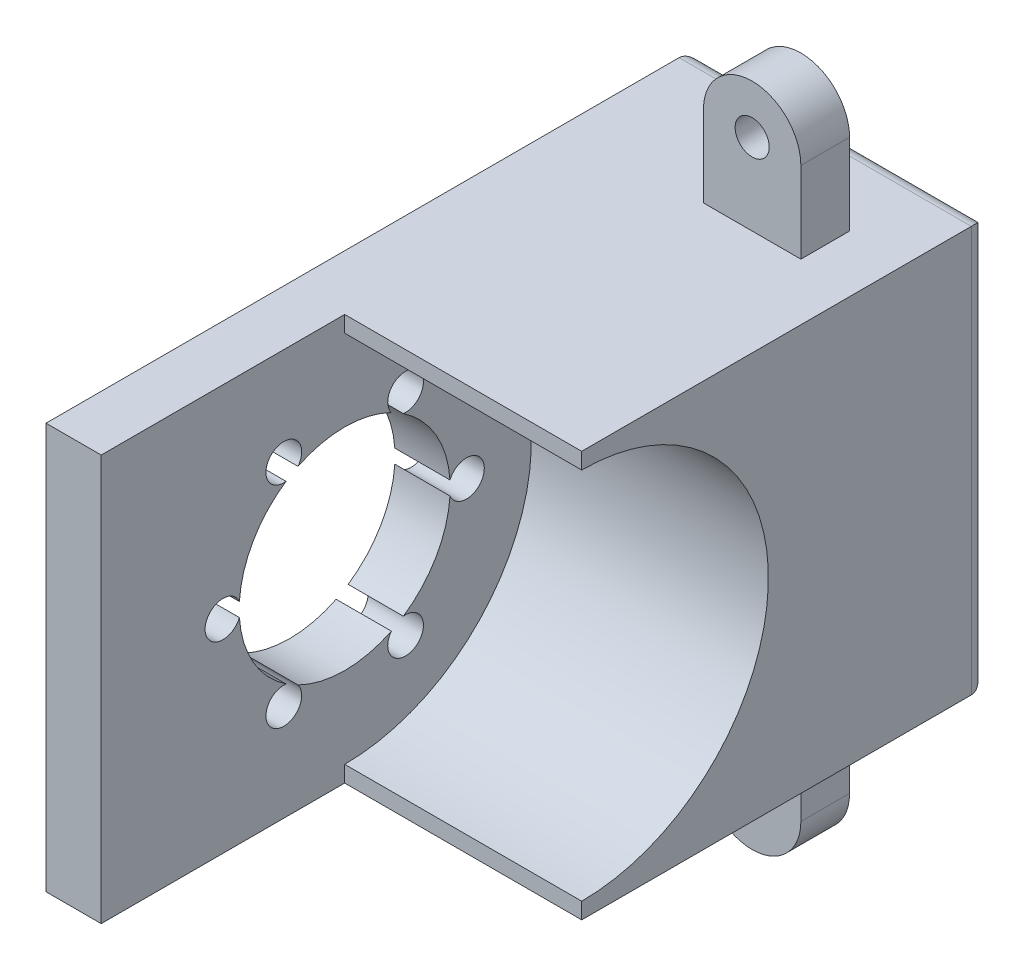
ISO-10303-21;
HEADER;
FILE_DESCRIPTION(('STEP AP214'),'2;1');
FILE_NAME('part.step','',(''),(''),'','','');
FILE_SCHEMA(('AUTOMOTIVE_DESIGN { 1 0 10303 214 1 1 1 1 }'));
ENDSEC;
DATA;
#1=APPLICATION_CONTEXT('core data for automotive mechanical design processes');
#2=APPLICATION_PROTOCOL_DEFINITION('international standard','automotive_design',2000,#1);
#3=PRODUCT_CONTEXT('',#1,'mechanical');
#4=PRODUCT('Part','Part','',(#3));
#5=PRODUCT_RELATED_PRODUCT_CATEGORY('part','',(#4));
#6=PRODUCT_DEFINITION_FORMATION('','',#4);
#7=PRODUCT_DEFINITION_CONTEXT('part definition',#1,'design');
#8=PRODUCT_DEFINITION('design','',#6,#7);
#9=PRODUCT_DEFINITION_SHAPE('','',#8);
#10=(LENGTH_UNIT() NAMED_UNIT(*) SI_UNIT(.MILLI.,.METRE.));
#11=(NAMED_UNIT(*) PLANE_ANGLE_UNIT() SI_UNIT($,.RADIAN.));
#12=(NAMED_UNIT(*) SI_UNIT($,.STERADIAN.) SOLID_ANGLE_UNIT());
#13=UNCERTAINTY_MEASURE_WITH_UNIT(LENGTH_MEASURE(1.E-05),#10,'distance_accuracy_value','');
#14=(GEOMETRIC_REPRESENTATION_CONTEXT(3) GLOBAL_UNCERTAINTY_ASSIGNED_CONTEXT((#13)) GLOBAL_UNIT_ASSIGNED_CONTEXT((#10,
#11,#12)) REPRESENTATION_CONTEXT('',''));
#15=CARTESIAN_POINT('',(0.,0.,0.));
#16=DIRECTION('',(0.,0.,1.));
#17=DIRECTION('',(1.,0.,0.));
#18=AXIS2_PLACEMENT_3D('',#15,#16,#17);
#19=CARTESIAN_POINT('',(-3.,-17.5,-17.));
#20=DIRECTION('',(-1.,0.,0.));
#21=DIRECTION('',(0.,-1.,0.));
#22=AXIS2_PLACEMENT_3D('',#19,#20,#21);
#23=PLANE('',#22);
#24=DIRECTION('',(0.,0.,-1.));
#25=VECTOR('',#24,1.);
#26=CARTESIAN_POINT('',(-3.,-12.5,-17.));
#27=LINE('',#26,#25);
#28=CARTESIAN_POINT('',(-3.,-12.5,-17.));
#29=VERTEX_POINT('',#28);
#30=CARTESIAN_POINT('',(-3.,-12.5,-20.));
#31=VERTEX_POINT('',#30);
#32=EDGE_CURVE('E542',#29,#31,#27,.T.);
#33=ORIENTED_EDGE('',*,*,#32,.T.);
#34=DIRECTION('',(0.,1.,0.));
#35=VECTOR('',#34,1.);
#36=CARTESIAN_POINT('',(-3.,-17.5,-20.));
#37=LINE('',#36,#35);
#38=CARTESIAN_POINT('',(-3.,-17.5,-20.));
#39=VERTEX_POINT('',#38);
#40=EDGE_CURVE('E520',#39,#31,#37,.T.);
#41=ORIENTED_EDGE('',*,*,#40,.F.);
#42=DIRECTION('',(0.,0.,-1.));
#43=VECTOR('',#42,1.);
#44=CARTESIAN_POINT('',(-3.,-17.5,-17.));
#45=LINE('',#44,#43);
#46=CARTESIAN_POINT('',(-3.,-17.5,-17.));
#47=VERTEX_POINT('',#46);
#48=EDGE_CURVE('E543',#47,#39,#45,.T.);
#49=ORIENTED_EDGE('',*,*,#48,.F.);
#50=DIRECTION('',(0.,1.,0.));
#51=VECTOR('',#50,1.);
#52=CARTESIAN_POINT('',(-3.,-17.5,-17.));
#53=LINE('',#52,#51);
#54=EDGE_CURVE('E530',#47,#29,#53,.T.);
#55=ORIENTED_EDGE('',*,*,#54,.T.);
#56=EDGE_LOOP('',(#33,#41,#49,#55));
#57=FACE_BOUND('',#56,.T.);
#58=ADVANCED_FACE('F95',(#57),#23,.T.);
#59=CARTESIAN_POINT('',(0.,-17.5,-17.));
#60=DIRECTION('',(0.,0.,-1.));
#61=DIRECTION('',(-1.,0.,0.));
#62=AXIS2_PLACEMENT_3D('',#59,#60,#61);
#63=CYLINDRICAL_SURFACE('',#62,3.);
#64=ORIENTED_EDGE('',*,*,#48,.T.);
#65=CARTESIAN_POINT('',(0.,-17.5,-20.));
#66=DIRECTION('',(0.,0.,-1.));
#67=DIRECTION('',(-1.,0.,0.));
#68=AXIS2_PLACEMENT_3D('',#65,#66,#67);
#69=CIRCLE('',#68,3.);
#70=CARTESIAN_POINT('',(3.,-17.5,-20.));
#71=VERTEX_POINT('',#70);
#72=EDGE_CURVE('E508',#71,#39,#69,.T.);
#73=ORIENTED_EDGE('',*,*,#72,.F.);
#74=DIRECTION('',(0.,0.,-1.));
#75=VECTOR('',#74,1.);
#76=CARTESIAN_POINT('',(3.,-17.5,-17.));
#77=LINE('',#76,#75);
#78=CARTESIAN_POINT('',(3.,-17.5,-17.));
#79=VERTEX_POINT('',#78);
#80=EDGE_CURVE('E547',#79,#71,#77,.T.);
#81=ORIENTED_EDGE('',*,*,#80,.F.);
#82=CARTESIAN_POINT('',(0.,-17.5,-17.));
#83=DIRECTION('',(0.,0.,-1.));
#84=DIRECTION('',(-1.,0.,0.));
#85=AXIS2_PLACEMENT_3D('',#82,#83,#84);
#86=CIRCLE('',#85,3.);
#87=EDGE_CURVE('E539',#79,#47,#86,.T.);
#88=ORIENTED_EDGE('',*,*,#87,.T.);
#89=EDGE_LOOP('',(#64,#73,#81,#88));
#90=FACE_BOUND('',#89,.T.);
#91=ADVANCED_FACE('F382',(#90),#63,.T.);
#92=CARTESIAN_POINT('',(3.,-17.5,-17.));
#93=DIRECTION('',(1.,0.,0.));
#94=DIRECTION('',(0.,0.,-1.));
#95=AXIS2_PLACEMENT_3D('',#92,#93,#94);
#96=PLANE('',#95);
#97=ORIENTED_EDGE('',*,*,#80,.T.);
#98=DIRECTION('',(0.,-1.,0.));
#99=VECTOR('',#98,1.);
#100=CARTESIAN_POINT('',(3.,-17.5,-20.));
#101=LINE('',#100,#99);
#102=CARTESIAN_POINT('',(3.,-12.5,-20.));
#103=VERTEX_POINT('',#102);
#104=EDGE_CURVE('E525',#103,#71,#101,.T.);
#105=ORIENTED_EDGE('',*,*,#104,.F.);
#106=DIRECTION('',(0.,0.,-1.));
#107=VECTOR('',#106,1.);
#108=CARTESIAN_POINT('',(3.,-12.5,-17.));
#109=LINE('',#108,#107);
#110=CARTESIAN_POINT('',(3.,-12.5,-17.));
#111=VERTEX_POINT('',#110);
#112=EDGE_CURVE('E550',#111,#103,#109,.T.);
#113=ORIENTED_EDGE('',*,*,#112,.F.);
#114=DIRECTION('',(0.,-1.,0.));
#115=VECTOR('',#114,1.);
#116=CARTESIAN_POINT('',(3.,-17.5,-17.));
#117=LINE('',#116,#115);
#118=EDGE_CURVE('E536',#111,#79,#117,.T.);
#119=ORIENTED_EDGE('',*,*,#118,.T.);
#120=EDGE_LOOP('',(#97,#105,#113,#119));
#121=FACE_BOUND('',#120,.T.);
#122=ADVANCED_FACE('F388',(#121),#96,.T.);
#123=CARTESIAN_POINT('',(0.,-17.5,-17.));
#124=DIRECTION('',(0.,0.,-1.));
#125=DIRECTION('',(-1.,0.,0.));
#126=AXIS2_PLACEMENT_3D('',#123,#124,#125);
#127=CYLINDRICAL_SURFACE('',#126,1.05);
#128=CARTESIAN_POINT('',(0.,-17.5,-17.));
#129=DIRECTION('',(0.,0.,-1.));
#130=DIRECTION('',(-1.,0.,0.));
#131=AXIS2_PLACEMENT_3D('',#128,#129,#130);
#132=CIRCLE('',#131,1.05);
#133=CARTESIAN_POINT('',(-1.05,-17.5,-17.));
#134=VERTEX_POINT('',#133);
#135=EDGE_CURVE('E517',#134,#134,#132,.T.);
#136=ORIENTED_EDGE('',*,*,#135,.F.);
#137=EDGE_LOOP('',(#136));
#138=FACE_BOUND('',#137,.T.);
#139=CARTESIAN_POINT('',(0.,-17.5,-20.));
#140=DIRECTION('',(0.,0.,-1.));
#141=DIRECTION('',(-1.,0.,0.));
#142=AXIS2_PLACEMENT_3D('',#139,#140,#141);
#143=CIRCLE('',#142,1.05);
#144=CARTESIAN_POINT('',(-1.05,-17.5,-20.));
#145=VERTEX_POINT('',#144);
#146=EDGE_CURVE('E361',#145,#145,#143,.T.);
#147=ORIENTED_EDGE('',*,*,#146,.T.);
#148=EDGE_LOOP('',(#147));
#149=FACE_BOUND('',#148,.T.);
#150=ADVANCED_FACE('F754',(#138,#149),#127,.F.);
#151=CARTESIAN_POINT('',(0.,12.5,-25.));
#152=DIRECTION('',(0.,-1.,0.));
#153=DIRECTION('',(0.,0.,-1.));
#154=AXIS2_PLACEMENT_3D('',#151,#152,#153);
#155=PLANE('',#154);
#156=DIRECTION('',(0.,0.,-1.));
#157=VECTOR('',#156,1.);
#158=CARTESIAN_POINT('',(6.5,12.5,-25.));
#159=LINE('',#158,#157);
#160=CARTESIAN_POINT('',(6.5,12.5,0.));
#161=VERTEX_POINT('',#160);
#162=CARTESIAN_POINT('',(6.5,12.5,-24.));
#163=VERTEX_POINT('',#162);
#164=EDGE_CURVE('E362',#161,#163,#159,.T.);
#165=ORIENTED_EDGE('',*,*,#164,.T.);
#166=DIRECTION('',(1.,0.,0.));
#167=VECTOR('',#166,1.);
#168=CARTESIAN_POINT('',(0.,12.5,-24.));
#169=LINE('',#168,#167);
#170=CARTESIAN_POINT('',(-11.5,12.5,-24.));
#171=VERTEX_POINT('',#170);
#172=EDGE_CURVE('E12',#163,#171,#169,.F.);
#173=ORIENTED_EDGE('',*,*,#172,.T.);
#174=DIRECTION('',(0.,0.,1.));
#175=VECTOR('',#174,1.);
#176=CARTESIAN_POINT('',(-11.5,12.5,-25.));
#177=LINE('',#176,#175);
#178=CARTESIAN_POINT('',(-11.5,12.5,15.));
#179=VERTEX_POINT('',#178);
#180=EDGE_CURVE('E487',#171,#179,#177,.T.);
#181=ORIENTED_EDGE('',*,*,#180,.T.);
#182=DIRECTION('',(-1.,0.,0.));
#183=VECTOR('',#182,1.);
#184=CARTESIAN_POINT('',(-11.5,12.5,15.));
#185=LINE('',#184,#183);
#186=CARTESIAN_POINT('',(-8.10000000000001,12.5,15.));
#187=VERTEX_POINT('',#186);
#188=EDGE_CURVE('E475',#187,#179,#185,.T.);
#189=ORIENTED_EDGE('',*,*,#188,.F.);
#190=DIRECTION('',(0.,0.,-1.));
#191=VECTOR('',#190,1.);
#192=CARTESIAN_POINT('',(-8.10000000000001,12.5,15.));
#193=LINE('',#192,#191);
#194=CARTESIAN_POINT('',(-8.1,12.5,0.));
#195=VERTEX_POINT('',#194);
#196=EDGE_CURVE('E482',#187,#195,#193,.T.);
#197=ORIENTED_EDGE('',*,*,#196,.T.);
#198=DIRECTION('',(1.,0.,0.));
#199=VECTOR('',#198,1.);
#200=CARTESIAN_POINT('',(0.,12.5,0.));
#201=LINE('',#200,#199);
#202=EDGE_CURVE('E467',#195,#161,#201,.T.);
#203=ORIENTED_EDGE('',*,*,#202,.T.);
#204=EDGE_LOOP('',(#165,#173,#181,#189,#197,#203));
#205=FACE_BOUND('',#204,.T.);
#206=DIRECTION('',(0.,0.,-1.));
#207=VECTOR('',#206,1.);
#208=CARTESIAN_POINT('',(3.,12.5,-17.));
#209=LINE('',#208,#207);
#210=CARTESIAN_POINT('',(3.,12.5,-17.));
#211=VERTEX_POINT('',#210);
#212=CARTESIAN_POINT('',(3.,12.5,-20.));
#213=VERTEX_POINT('',#212);
#214=EDGE_CURVE('E576',#211,#213,#209,.T.);
#215=ORIENTED_EDGE('',*,*,#214,.F.);
#216=DIRECTION('',(-1.,0.,0.));
#217=VECTOR('',#216,1.);
#218=CARTESIAN_POINT('',(3.,12.5,-17.));
#219=LINE('',#218,#217);
#220=CARTESIAN_POINT('',(-3.,12.5,-17.));
#221=VERTEX_POINT('',#220);
#222=EDGE_CURVE('E562',#211,#221,#219,.T.);
#223=ORIENTED_EDGE('',*,*,#222,.T.);
#224=DIRECTION('',(0.,0.,-1.));
#225=VECTOR('',#224,1.);
#226=CARTESIAN_POINT('',(-3.,12.5,-17.));
#227=LINE('',#226,#225);
#228=CARTESIAN_POINT('',(-3.,12.5,-20.));
#229=VERTEX_POINT('',#228);
#230=EDGE_CURVE('E573',#221,#229,#227,.T.);
#231=ORIENTED_EDGE('',*,*,#230,.T.);
#232=DIRECTION('',(-1.,0.,0.));
#233=VECTOR('',#232,1.);
#234=CARTESIAN_POINT('',(3.,12.5,-20.));
#235=LINE('',#234,#233);
#236=EDGE_CURVE('E513',#213,#229,#235,.T.);
#237=ORIENTED_EDGE('',*,*,#236,.F.);
#238=EDGE_LOOP('',(#215,#223,#231,#237));
#239=FACE_BOUND('',#238,.T.);
#240=ADVANCED_FACE('F490',(#205,#239),#155,.F.);
#241=CARTESIAN_POINT('',(0.,0.,0.));
#242=DIRECTION('',(0.,0.,1.));
#243=DIRECTION('',(1.,0.,0.));
#244=AXIS2_PLACEMENT_3D('',#241,#242,#243);
#245=PLANE('',#244);
#246=DIRECTION('',(0.,-1.,0.));
#247=VECTOR('',#246,1.);
#248=CARTESIAN_POINT('',(6.5,0.,0.));
#249=LINE('',#248,#247);
#250=CARTESIAN_POINT('',(6.5,11.5,0.));
#251=VERTEX_POINT('',#250);
#252=EDGE_CURVE('E298',#161,#251,#249,.T.);
#253=ORIENTED_EDGE('',*,*,#252,.F.);
#254=ORIENTED_EDGE('',*,*,#202,.F.);
#255=DIRECTION('',(0.,1.,0.));
#256=VECTOR('',#255,1.);
#257=CARTESIAN_POINT('',(-8.10000000000001,12.5,0.));
#258=LINE('',#257,#256);
#259=CARTESIAN_POINT('',(-8.10000000000001,11.5,0.));
#260=VERTEX_POINT('',#259);
#261=EDGE_CURVE('E463',#260,#195,#258,.T.);
#262=ORIENTED_EDGE('',*,*,#261,.F.);
#263=DIRECTION('',(1.,0.,0.));
#264=VECTOR('',#263,1.);
#265=CARTESIAN_POINT('',(11.5,11.5,0.));
#266=LINE('',#265,#264);
#267=EDGE_CURVE('E316',#260,#251,#266,.T.);
#268=ORIENTED_EDGE('',*,*,#267,.T.);
#269=EDGE_LOOP('',(#253,#254,#262,#268));
#270=FACE_BOUND('',#269,.T.);
#271=ADVANCED_FACE('F471',(#270),#245,.T.);
#272=DIRECTION('',(0.,-1.,0.));
#273=VECTOR('',#272,1.);
#274=CARTESIAN_POINT('',(6.5,0.,0.));
#275=LINE('',#274,#273);
#276=CARTESIAN_POINT('',(6.5,-11.5,0.));
#277=VERTEX_POINT('',#276);
#278=CARTESIAN_POINT('',(6.5,-12.5,0.));
#279=VERTEX_POINT('',#278);
#280=EDGE_CURVE('E295',#277,#279,#275,.T.);
#281=ORIENTED_EDGE('',*,*,#280,.F.);
#282=DIRECTION('',(1.,0.,0.));
#283=VECTOR('',#282,1.);
#284=CARTESIAN_POINT('',(11.5,-11.5,0.));
#285=LINE('',#284,#283);
#286=CARTESIAN_POINT('',(-8.1,-11.5,0.));
#287=VERTEX_POINT('',#286);
#288=EDGE_CURVE('E303',#277,#287,#285,.F.);
#289=ORIENTED_EDGE('',*,*,#288,.T.);
#290=CARTESIAN_POINT('',(-8.1,-12.5,0.));
#291=VERTEX_POINT('',#290);
#292=EDGE_CURVE('E466',#291,#287,#258,.T.);
#293=ORIENTED_EDGE('',*,*,#292,.F.);
#294=DIRECTION('',(1.,0.,0.));
#295=VECTOR('',#294,1.);
#296=CARTESIAN_POINT('',(0.,-12.5,0.));
#297=LINE('',#296,#295);
#298=EDGE_CURVE('E310',#291,#279,#297,.T.);
#299=ORIENTED_EDGE('',*,*,#298,.T.);
#300=EDGE_LOOP('',(#281,#289,#293,#299));
#301=FACE_BOUND('',#300,.T.);
#302=ADVANCED_FACE('F307',(#301),#245,.T.);
#303=CARTESIAN_POINT('',(0.,-12.5,-25.));
#304=DIRECTION('',(0.,-1.,0.));
#305=DIRECTION('',(0.,0.,-1.));
#306=AXIS2_PLACEMENT_3D('',#303,#304,#305);
#307=PLANE('',#306);
#308=DIRECTION('',(0.,0.,1.));
#309=VECTOR('',#308,1.);
#310=CARTESIAN_POINT('',(-11.5,-12.5,-25.));
#311=LINE('',#310,#309);
#312=CARTESIAN_POINT('',(-11.5,-12.5,-24.));
#313=VERTEX_POINT('',#312);
#314=CARTESIAN_POINT('',(-11.5,-12.5,15.));
#315=VERTEX_POINT('',#314);
#316=EDGE_CURVE('E318',#313,#315,#311,.T.);
#317=ORIENTED_EDGE('',*,*,#316,.F.);
#318=DIRECTION('',(1.,0.,0.));
#319=VECTOR('',#318,1.);
#320=CARTESIAN_POINT('',(6.5,-12.5,-24.));
#321=LINE('',#320,#319);
#322=CARTESIAN_POINT('',(6.5,-12.5,-24.));
#323=VERTEX_POINT('',#322);
#324=EDGE_CURVE('E333',#313,#323,#321,.T.);
#325=ORIENTED_EDGE('',*,*,#324,.T.);
#326=DIRECTION('',(0.,0.,-1.));
#327=VECTOR('',#326,1.);
#328=CARTESIAN_POINT('',(6.5,-12.5,-25.));
#329=LINE('',#328,#327);
#330=EDGE_CURVE('E358',#279,#323,#329,.T.);
#331=ORIENTED_EDGE('',*,*,#330,.F.);
#332=ORIENTED_EDGE('',*,*,#298,.F.);
#333=DIRECTION('',(0.,0.,-1.));
#334=VECTOR('',#333,1.);
#335=CARTESIAN_POINT('',(-8.1,-12.5,15.));
#336=LINE('',#335,#334);
#337=CARTESIAN_POINT('',(-8.1,-12.5,15.));
#338=VERTEX_POINT('',#337);
#339=EDGE_CURVE('E468',#338,#291,#336,.T.);
#340=ORIENTED_EDGE('',*,*,#339,.F.);
#341=DIRECTION('',(1.,0.,0.));
#342=VECTOR('',#341,1.);
#343=CARTESIAN_POINT('',(-8.1,-12.5,15.));
#344=LINE('',#343,#342);
#345=EDGE_CURVE('E495',#315,#338,#344,.T.);
#346=ORIENTED_EDGE('',*,*,#345,.F.);
#347=EDGE_LOOP('',(#317,#325,#331,#332,#340,#346));
#348=FACE_BOUND('',#347,.T.);
#349=ORIENTED_EDGE('',*,*,#32,.F.);
#350=DIRECTION('',(1.,0.,0.));
#351=VECTOR('',#350,1.);
#352=CARTESIAN_POINT('',(3.,-12.5,-17.));
#353=LINE('',#352,#351);
#354=EDGE_CURVE('E533',#29,#111,#353,.T.);
#355=ORIENTED_EDGE('',*,*,#354,.T.);
#356=ORIENTED_EDGE('',*,*,#112,.T.);
#357=DIRECTION('',(1.,0.,0.));
#358=VECTOR('',#357,1.);
#359=CARTESIAN_POINT('',(3.,-12.5,-20.));
#360=LINE('',#359,#358);
#361=EDGE_CURVE('E523',#31,#103,#360,.T.);
#362=ORIENTED_EDGE('',*,*,#361,.F.);
#363=EDGE_LOOP('',(#349,#355,#356,#362));
#364=FACE_BOUND('',#363,.T.);
#365=ADVANCED_FACE('F356',(#348,#364),#307,.T.);
#366=CARTESIAN_POINT('',(-11.5,0.,-25.));
#367=DIRECTION('',(-1.,0.,0.));
#368=DIRECTION('',(0.,0.,1.));
#369=AXIS2_PLACEMENT_3D('',#366,#367,#368);
#370=PLANE('',#369);
#371=CARTESIAN_POINT('',(-11.5,0.,0.));
#372=DIRECTION('',(-1.,0.,0.));
#373=DIRECTION('',(0.,0.,1.));
#374=AXIS2_PLACEMENT_3D('',#371,#372,#373);
#375=CIRCLE('',#374,6.5);
#376=CARTESIAN_POINT('',(-11.5,0.426384802731103,6.486));
#377=VERTEX_POINT('',#376);
#378=CARTESIAN_POINT('',(-11.5,5.40384836758037,3.61226007095266));
#379=VERTEX_POINT('',#378);
#380=EDGE_CURVE('E633',#377,#379,#375,.T.);
#381=ORIENTED_EDGE('',*,*,#380,.F.);
#382=CARTESIAN_POINT('',(-11.5,0.,7.5));
#383=DIRECTION('',(-1.,0.,0.));
#384=DIRECTION('',(0.,0.,1.));
#385=AXIS2_PLACEMENT_3D('',#382,#383,#384);
#386=CIRCLE('',#385,1.1);
#387=CARTESIAN_POINT('',(-11.5,-0.426384802731013,6.486));
#388=VERTEX_POINT('',#387);
#389=EDGE_CURVE('E639',#388,#377,#386,.T.);
#390=ORIENTED_EDGE('',*,*,#389,.F.);
#391=CARTESIAN_POINT('',(-11.5,0.,0.));
#392=DIRECTION('',(-1.,0.,0.));
#393=DIRECTION('',(0.,0.,1.));
#394=AXIS2_PLACEMENT_3D('',#391,#392,#393);
#395=CIRCLE('',#394,6.5);
#396=CARTESIAN_POINT('',(-11.5,-5.40384836758033,3.61226007095273));
#397=VERTEX_POINT('',#396);
#398=EDGE_CURVE('E635',#397,#388,#395,.T.);
#399=ORIENTED_EDGE('',*,*,#398,.F.);
#400=CARTESIAN_POINT('',(-11.5,-6.49519052838327,3.75000000000003));
#401=DIRECTION('',(-1.,0.,0.));
#402=DIRECTION('',(0.,0.,1.));
#403=AXIS2_PLACEMENT_3D('',#400,#401,#402);
#404=CIRCLE('',#403,1.1);
#405=CARTESIAN_POINT('',(-11.5,-5.83023317031138,2.87373992904732));
#406=VERTEX_POINT('',#405);
#407=EDGE_CURVE('E476',#406,#397,#404,.T.);
#408=ORIENTED_EDGE('',*,*,#407,.F.);
#409=CARTESIAN_POINT('',(-11.5,0.,0.));
#410=DIRECTION('',(-1.,0.,0.));
#411=DIRECTION('',(0.,0.,1.));
#412=AXIS2_PLACEMENT_3D('',#409,#410,#411);
#413=CIRCLE('',#412,6.5);
#414=CARTESIAN_POINT('',(-11.5,-5.83023317031144,-2.8737399290472));
#415=VERTEX_POINT('',#414);
#416=EDGE_CURVE('E637',#415,#406,#413,.T.);
#417=ORIENTED_EDGE('',*,*,#416,.F.);
#418=CARTESIAN_POINT('',(-11.5,-6.49519052838335,-3.74999999999989));
#419=DIRECTION('',(-1.,0.,0.));
#420=DIRECTION('',(0.,0.,1.));
#421=AXIS2_PLACEMENT_3D('',#418,#419,#420);
#422=CIRCLE('',#421,1.1);
#423=CARTESIAN_POINT('',(-11.5,-5.4038483675804,-3.61226007095262));
#424=VERTEX_POINT('',#423);
#425=EDGE_CURVE('E643',#424,#415,#422,.T.);
#426=ORIENTED_EDGE('',*,*,#425,.F.);
#427=CARTESIAN_POINT('',(-11.5,0.,0.));
#428=DIRECTION('',(-1.,0.,0.));
#429=DIRECTION('',(0.,0.,1.));
#430=AXIS2_PLACEMENT_3D('',#427,#428,#429);
#431=CIRCLE('',#430,6.5);
#432=CARTESIAN_POINT('',(-11.5,-0.426384802731058,-6.486));
#433=VERTEX_POINT('',#432);
#434=EDGE_CURVE('E588',#433,#424,#431,.T.);
#435=ORIENTED_EDGE('',*,*,#434,.F.);
#436=CARTESIAN_POINT('',(-11.5,0.,-7.5));
#437=DIRECTION('',(-1.,0.,0.));
#438=DIRECTION('',(0.,0.,1.));
#439=AXIS2_PLACEMENT_3D('',#436,#437,#438);
#440=CIRCLE('',#439,1.1);
#441=CARTESIAN_POINT('',(-11.5,0.426384802731058,-6.486));
#442=VERTEX_POINT('',#441);
#443=EDGE_CURVE('E645',#442,#433,#440,.T.);
#444=ORIENTED_EDGE('',*,*,#443,.F.);
#445=CARTESIAN_POINT('',(-11.5,0.,0.));
#446=DIRECTION('',(-1.,0.,0.));
#447=DIRECTION('',(0.,0.,1.));
#448=AXIS2_PLACEMENT_3D('',#445,#446,#447);
#449=CIRCLE('',#448,6.5);
#450=CARTESIAN_POINT('',(-11.5,5.4038483675803,-3.61226007095278));
#451=VERTEX_POINT('',#450);
#452=EDGE_CURVE('E629',#451,#442,#449,.T.);
#453=ORIENTED_EDGE('',*,*,#452,.F.);
#454=CARTESIAN_POINT('',(-11.5,6.49519052838325,-3.75000000000008));
#455=DIRECTION('',(-1.,0.,0.));
#456=DIRECTION('',(0.,0.,1.));
#457=AXIS2_PLACEMENT_3D('',#454,#455,#456);
#458=CIRCLE('',#457,1.1);
#459=CARTESIAN_POINT('',(-11.5,5.83023317031137,-2.87373992904736));
#460=VERTEX_POINT('',#459);
#461=EDGE_CURVE('E641',#460,#451,#458,.T.);
#462=ORIENTED_EDGE('',*,*,#461,.F.);
#463=CARTESIAN_POINT('',(-11.5,0.,0.));
#464=DIRECTION('',(-1.,0.,0.));
#465=DIRECTION('',(0.,0.,1.));
#466=AXIS2_PLACEMENT_3D('',#463,#464,#465);
#467=CIRCLE('',#466,6.5);
#468=CARTESIAN_POINT('',(-11.5,5.83023317031143,2.87373992904723));
#469=VERTEX_POINT('',#468);
#470=EDGE_CURVE('E631',#469,#460,#467,.T.);
#471=ORIENTED_EDGE('',*,*,#470,.F.);
#472=CARTESIAN_POINT('',(-11.5,6.49519052838333,3.74999999999994));
#473=DIRECTION('',(-1.,0.,0.));
#474=DIRECTION('',(0.,0.,1.));
#475=AXIS2_PLACEMENT_3D('',#472,#473,#474);
#476=CIRCLE('',#475,1.1);
#477=EDGE_CURVE('E473',#379,#469,#476,.T.);
#478=ORIENTED_EDGE('',*,*,#477,.F.);
#479=EDGE_LOOP('',(#381,#390,#399,#408,#417,#426,#435,#444,#453,#462,#471,#478));
#480=FACE_BOUND('',#479,.T.);
#481=ORIENTED_EDGE('',*,*,#180,.F.);
#482=DIRECTION('',(0.,-1.,0.));
#483=VECTOR('',#482,1.);
#484=CARTESIAN_POINT('',(-11.5,-12.5,-24.));
#485=LINE('',#484,#483);
#486=EDGE_CURVE('E104',#171,#313,#485,.T.);
#487=ORIENTED_EDGE('',*,*,#486,.T.);
#488=ORIENTED_EDGE('',*,*,#316,.T.);
#489=DIRECTION('',(0.,-1.,0.));
#490=VECTOR('',#489,1.);
#491=CARTESIAN_POINT('',(-11.5,-12.5,15.));
#492=LINE('',#491,#490);
#493=EDGE_CURVE('E494',#179,#315,#492,.T.);
#494=ORIENTED_EDGE('',*,*,#493,.F.);
#495=EDGE_LOOP('',(#481,#487,#488,#494));
#496=FACE_BOUND('',#495,.T.);
#497=ADVANCED_FACE('F370',(#480,#496),#370,.T.);
#498=CARTESIAN_POINT('',(0.,0.,-25.));
#499=DIRECTION('',(0.,0.,1.));
#500=DIRECTION('',(1.,0.,0.));
#501=AXIS2_PLACEMENT_3D('',#498,#499,#500);
#502=PLANE('',#501);
#503=DIRECTION('',(1.,0.,0.));
#504=VECTOR('',#503,1.);
#505=CARTESIAN_POINT('',(0.,11.5,-25.));
#506=LINE('',#505,#504);
#507=CARTESIAN_POINT('',(-10.5,11.5,-25.));
#508=VERTEX_POINT('',#507);
#509=CARTESIAN_POINT('',(5.5,11.5,-25.));
#510=VERTEX_POINT('',#509);
#511=EDGE_CURVE('E302',#508,#510,#506,.T.);
#512=ORIENTED_EDGE('',*,*,#511,.T.);
#513=DIRECTION('',(0.,-1.,0.));
#514=VECTOR('',#513,1.);
#515=CARTESIAN_POINT('',(5.5,0.,-25.));
#516=LINE('',#515,#514);
#517=CARTESIAN_POINT('',(5.5,-11.5,-25.));
#518=VERTEX_POINT('',#517);
#519=EDGE_CURVE('E327',#510,#518,#516,.T.);
#520=ORIENTED_EDGE('',*,*,#519,.T.);
#521=DIRECTION('',(1.,0.,0.));
#522=VECTOR('',#521,1.);
#523=CARTESIAN_POINT('',(-11.5,-11.5,-25.));
#524=LINE('',#523,#522);
#525=CARTESIAN_POINT('',(-10.5,-11.5,-25.));
#526=VERTEX_POINT('',#525);
#527=EDGE_CURVE('E325',#518,#526,#524,.F.);
#528=ORIENTED_EDGE('',*,*,#527,.T.);
#529=DIRECTION('',(0.,-1.,0.));
#530=VECTOR('',#529,1.);
#531=CARTESIAN_POINT('',(-10.5,12.5,-25.));
#532=LINE('',#531,#530);
#533=EDGE_CURVE('E323',#526,#508,#532,.F.);
#534=ORIENTED_EDGE('',*,*,#533,.T.);
#535=EDGE_LOOP('',(#512,#520,#528,#534));
#536=FACE_BOUND('',#535,.T.);
#537=ADVANCED_FACE('F368',(#536),#502,.F.);
#538=CARTESIAN_POINT('',(11.5,0.,0.));
#539=DIRECTION('',(1.,0.,0.));
#540=DIRECTION('',(0.,0.,-1.));
#541=AXIS2_PLACEMENT_3D('',#538,#539,#540);
#542=CYLINDRICAL_SURFACE('',#541,11.5);
#543=CARTESIAN_POINT('',(6.5,0.,0.));
#544=DIRECTION('',(-1.,0.,0.));
#545=DIRECTION('',(0.,0.,1.));
#546=AXIS2_PLACEMENT_3D('',#543,#544,#545);
#547=CIRCLE('',#546,11.5);
#548=EDGE_CURVE('E291',#251,#277,#547,.T.);
#549=ORIENTED_EDGE('',*,*,#548,.F.);
#550=ORIENTED_EDGE('',*,*,#267,.F.);
#551=CARTESIAN_POINT('',(-8.1,0.,0.));
#552=DIRECTION('',(1.,0.,0.));
#553=DIRECTION('',(0.,0.,-1.));
#554=AXIS2_PLACEMENT_3D('',#551,#552,#553);
#555=CIRCLE('',#554,11.5);
#556=EDGE_CURVE('E314',#287,#260,#555,.T.);
#557=ORIENTED_EDGE('',*,*,#556,.F.);
#558=ORIENTED_EDGE('',*,*,#288,.F.);
#559=EDGE_LOOP('',(#549,#550,#557,#558));
#560=FACE_BOUND('',#559,.T.);
#561=ADVANCED_FACE('F312',(#560),#542,.F.);
#562=CARTESIAN_POINT('',(-8.1,-11.5,0.));
#563=DIRECTION('',(1.,0.,0.));
#564=DIRECTION('',(0.,0.,-1.));
#565=AXIS2_PLACEMENT_3D('',#562,#563,#564);
#566=PLANE('',#565);
#567=CARTESIAN_POINT('',(-8.1,0.,0.));
#568=DIRECTION('',(1.,0.,0.));
#569=DIRECTION('',(0.,0.,-1.));
#570=AXIS2_PLACEMENT_3D('',#567,#568,#569);
#571=CIRCLE('',#570,6.5);
#572=CARTESIAN_POINT('',(-8.1,5.40384836758037,3.61226007095266));
#573=VERTEX_POINT('',#572);
#574=CARTESIAN_POINT('',(-8.1,0.426384802731103,6.486));
#575=VERTEX_POINT('',#574);
#576=EDGE_CURVE('E459',#573,#575,#571,.T.);
#577=ORIENTED_EDGE('',*,*,#576,.F.);
#578=CARTESIAN_POINT('',(-8.1,6.49519052838333,3.74999999999994));
#579=DIRECTION('',(1.,0.,0.));
#580=DIRECTION('',(0.,0.,-1.));
#581=AXIS2_PLACEMENT_3D('',#578,#579,#580);
#582=CIRCLE('',#581,1.1);
#583=CARTESIAN_POINT('',(-8.1,5.83023317031143,2.87373992904723));
#584=VERTEX_POINT('',#583);
#585=EDGE_CURVE('E581',#584,#573,#582,.T.);
#586=ORIENTED_EDGE('',*,*,#585,.F.);
#587=CARTESIAN_POINT('',(-8.1,5.83023317031137,-2.87373992904736));
#588=VERTEX_POINT('',#587);
#589=EDGE_CURVE('E665',#588,#584,#571,.T.);
#590=ORIENTED_EDGE('',*,*,#589,.F.);
#591=CARTESIAN_POINT('',(-8.1,6.49519052838325,-3.75000000000008));
#592=DIRECTION('',(1.,0.,0.));
#593=DIRECTION('',(0.,0.,-1.));
#594=AXIS2_PLACEMENT_3D('',#591,#592,#593);
#595=CIRCLE('',#594,1.1);
#596=CARTESIAN_POINT('',(-8.1,5.4038483675803,-3.61226007095278));
#597=VERTEX_POINT('',#596);
#598=EDGE_CURVE('E597',#597,#588,#595,.T.);
#599=ORIENTED_EDGE('',*,*,#598,.F.);
#600=CARTESIAN_POINT('',(-8.1,0.426384802731058,-6.486));
#601=VERTEX_POINT('',#600);
#602=EDGE_CURVE('E627',#601,#597,#571,.T.);
#603=ORIENTED_EDGE('',*,*,#602,.F.);
#604=CARTESIAN_POINT('',(-8.1,0.,-7.5));
#605=DIRECTION('',(1.,0.,0.));
#606=DIRECTION('',(0.,0.,-1.));
#607=AXIS2_PLACEMENT_3D('',#604,#605,#606);
#608=CIRCLE('',#607,1.1);
#609=CARTESIAN_POINT('',(-8.1,-0.426384802731058,-6.486));
#610=VERTEX_POINT('',#609);
#611=EDGE_CURVE('E604',#610,#601,#608,.T.);
#612=ORIENTED_EDGE('',*,*,#611,.F.);
#613=CARTESIAN_POINT('',(-8.1,-5.4038483675804,-3.61226007095262));
#614=VERTEX_POINT('',#613);
#615=EDGE_CURVE('E621',#614,#610,#571,.T.);
#616=ORIENTED_EDGE('',*,*,#615,.F.);
#617=CARTESIAN_POINT('',(-8.1,-6.49519052838335,-3.74999999999989));
#618=DIRECTION('',(1.,0.,0.));
#619=DIRECTION('',(0.,0.,-1.));
#620=AXIS2_PLACEMENT_3D('',#617,#618,#619);
#621=CIRCLE('',#620,1.1);
#622=CARTESIAN_POINT('',(-8.1,-5.83023317031144,-2.8737399290472));
#623=VERTEX_POINT('',#622);
#624=EDGE_CURVE('E618',#623,#614,#621,.T.);
#625=ORIENTED_EDGE('',*,*,#624,.F.);
#626=CARTESIAN_POINT('',(-8.1,-5.83023317031138,2.87373992904732));
#627=VERTEX_POINT('',#626);
#628=EDGE_CURVE('E572',#627,#623,#571,.T.);
#629=ORIENTED_EDGE('',*,*,#628,.F.);
#630=CARTESIAN_POINT('',(-8.1,-6.49519052838327,3.75000000000003));
#631=DIRECTION('',(1.,0.,0.));
#632=DIRECTION('',(0.,0.,-1.));
#633=AXIS2_PLACEMENT_3D('',#630,#631,#632);
#634=CIRCLE('',#633,1.1);
#635=CARTESIAN_POINT('',(-8.1,-5.40384836758033,3.61226007095273));
#636=VERTEX_POINT('',#635);
#637=EDGE_CURVE('E611',#636,#627,#634,.T.);
#638=ORIENTED_EDGE('',*,*,#637,.F.);
#639=CARTESIAN_POINT('',(-8.1,-0.426384802731013,6.486));
#640=VERTEX_POINT('',#639);
#641=EDGE_CURVE('E656',#640,#636,#571,.T.);
#642=ORIENTED_EDGE('',*,*,#641,.F.);
#643=CARTESIAN_POINT('',(-8.1,0.,7.5));
#644=DIRECTION('',(1.,0.,0.));
#645=DIRECTION('',(0.,0.,-1.));
#646=AXIS2_PLACEMENT_3D('',#643,#644,#645);
#647=CIRCLE('',#646,1.1);
#648=EDGE_CURVE('E590',#575,#640,#647,.T.);
#649=ORIENTED_EDGE('',*,*,#648,.F.);
#650=EDGE_LOOP('',(#577,#586,#590,#599,#603,#612,#616,#625,#629,#638,#642,#649));
#651=FACE_BOUND('',#650,.T.);
#652=ORIENTED_EDGE('',*,*,#556,.T.);
#653=ORIENTED_EDGE('',*,*,#261,.T.);
#654=ORIENTED_EDGE('',*,*,#196,.F.);
#655=DIRECTION('',(0.,1.,0.));
#656=VECTOR('',#655,1.);
#657=CARTESIAN_POINT('',(-8.10000000000001,12.5,15.));
#658=LINE('',#657,#656);
#659=EDGE_CURVE('E480',#338,#187,#658,.T.);
#660=ORIENTED_EDGE('',*,*,#659,.F.);
#661=ORIENTED_EDGE('',*,*,#339,.T.);
#662=ORIENTED_EDGE('',*,*,#292,.T.);
#663=EDGE_LOOP('',(#652,#653,#654,#660,#661,#662));
#664=FACE_BOUND('',#663,.T.);
#665=ADVANCED_FACE('F376',(#651,#664),#566,.T.);
#666=CARTESIAN_POINT('',(0.,0.,15.));
#667=DIRECTION('',(0.,0.,-1.));
#668=DIRECTION('',(-1.,0.,0.));
#669=AXIS2_PLACEMENT_3D('',#666,#667,#668);
#670=PLANE('',#669);
#671=ORIENTED_EDGE('',*,*,#188,.T.);
#672=ORIENTED_EDGE('',*,*,#493,.T.);
#673=ORIENTED_EDGE('',*,*,#345,.T.);
#674=ORIENTED_EDGE('',*,*,#659,.T.);
#675=EDGE_LOOP('',(#671,#672,#673,#674));
#676=FACE_BOUND('',#675,.T.);
#677=ADVANCED_FACE('F420',(#676),#670,.F.);
#678=CARTESIAN_POINT('',(-12.1,6.49519052838333,3.74999999999994));
#679=DIRECTION('',(1.,0.,0.));
#680=DIRECTION('',(0.,0.,-1.));
#681=AXIS2_PLACEMENT_3D('',#678,#679,#680);
#682=CYLINDRICAL_SURFACE('',#681,1.1);
#683=ORIENTED_EDGE('',*,*,#477,.T.);
#684=DIRECTION('',(1.,0.,0.));
#685=VECTOR('',#684,1.);
#686=CARTESIAN_POINT('',(-12.1,5.83023317031143,2.87373992904723));
#687=LINE('',#686,#685);
#688=EDGE_CURVE('E584',#469,#584,#687,.T.);
#689=ORIENTED_EDGE('',*,*,#688,.T.);
#690=ORIENTED_EDGE('',*,*,#585,.T.);
#691=DIRECTION('',(1.,0.,0.));
#692=VECTOR('',#691,1.);
#693=CARTESIAN_POINT('',(-12.1,5.40384836758037,3.61226007095266));
#694=LINE('',#693,#692);
#695=EDGE_CURVE('E586',#379,#573,#694,.T.);
#696=ORIENTED_EDGE('',*,*,#695,.F.);
#697=EDGE_LOOP('',(#683,#689,#690,#696));
#698=FACE_BOUND('',#697,.T.);
#699=ADVANCED_FACE('F416',(#698),#682,.F.);
#700=CARTESIAN_POINT('',(-12.1,-6.49519052838327,3.75000000000003));
#701=DIRECTION('',(1.,0.,0.));
#702=DIRECTION('',(0.,0.,-1.));
#703=AXIS2_PLACEMENT_3D('',#700,#701,#702);
#704=CYLINDRICAL_SURFACE('',#703,1.1);
#705=ORIENTED_EDGE('',*,*,#407,.T.);
#706=DIRECTION('',(1.,0.,0.));
#707=VECTOR('',#706,1.);
#708=CARTESIAN_POINT('',(-12.1,-5.40384836758033,3.61226007095273));
#709=LINE('',#708,#707);
#710=EDGE_CURVE('E614',#397,#636,#709,.T.);
#711=ORIENTED_EDGE('',*,*,#710,.T.);
#712=ORIENTED_EDGE('',*,*,#637,.T.);
#713=DIRECTION('',(1.,0.,0.));
#714=VECTOR('',#713,1.);
#715=CARTESIAN_POINT('',(-12.1,-5.83023317031138,2.87373992904732));
#716=LINE('',#715,#714);
#717=EDGE_CURVE('E608',#406,#627,#716,.T.);
#718=ORIENTED_EDGE('',*,*,#717,.F.);
#719=EDGE_LOOP('',(#705,#711,#712,#718));
#720=FACE_BOUND('',#719,.T.);
#721=ADVANCED_FACE('F419',(#720),#704,.F.);
#722=CARTESIAN_POINT('',(-12.1,0.,-7.5));
#723=DIRECTION('',(1.,0.,0.));
#724=DIRECTION('',(0.,0.,-1.));
#725=AXIS2_PLACEMENT_3D('',#722,#723,#724);
#726=CYLINDRICAL_SURFACE('',#725,1.1);
#727=ORIENTED_EDGE('',*,*,#443,.T.);
#728=DIRECTION('',(1.,0.,0.));
#729=VECTOR('',#728,1.);
#730=CARTESIAN_POINT('',(-12.1,-0.426384802731058,-6.486));
#731=LINE('',#730,#729);
#732=EDGE_CURVE('E607',#433,#610,#731,.T.);
#733=ORIENTED_EDGE('',*,*,#732,.T.);
#734=ORIENTED_EDGE('',*,*,#611,.T.);
#735=DIRECTION('',(1.,0.,0.));
#736=VECTOR('',#735,1.);
#737=CARTESIAN_POINT('',(-12.1,0.426384802731058,-6.486));
#738=LINE('',#737,#736);
#739=EDGE_CURVE('E601',#442,#601,#738,.T.);
#740=ORIENTED_EDGE('',*,*,#739,.F.);
#741=EDGE_LOOP('',(#727,#733,#734,#740));
#742=FACE_BOUND('',#741,.T.);
#743=ADVANCED_FACE('F432',(#742),#726,.F.);
#744=CARTESIAN_POINT('',(-12.1,-6.49519052838335,-3.74999999999989));
#745=DIRECTION('',(1.,0.,0.));
#746=DIRECTION('',(0.,0.,-1.));
#747=AXIS2_PLACEMENT_3D('',#744,#745,#746);
#748=CYLINDRICAL_SURFACE('',#747,1.1);
#749=ORIENTED_EDGE('',*,*,#425,.T.);
#750=DIRECTION('',(1.,0.,0.));
#751=VECTOR('',#750,1.);
#752=CARTESIAN_POINT('',(-12.1,-5.83023317031144,-2.8737399290472));
#753=LINE('',#752,#751);
#754=EDGE_CURVE('E620',#415,#623,#753,.T.);
#755=ORIENTED_EDGE('',*,*,#754,.T.);
#756=ORIENTED_EDGE('',*,*,#624,.T.);
#757=DIRECTION('',(1.,0.,0.));
#758=VECTOR('',#757,1.);
#759=CARTESIAN_POINT('',(-12.1,-5.4038483675804,-3.61226007095262));
#760=LINE('',#759,#758);
#761=EDGE_CURVE('E615',#424,#614,#760,.T.);
#762=ORIENTED_EDGE('',*,*,#761,.F.);
#763=EDGE_LOOP('',(#749,#755,#756,#762));
#764=FACE_BOUND('',#763,.T.);
#765=ADVANCED_FACE('F430',(#764),#748,.F.);
#766=CARTESIAN_POINT('',(-12.1,6.49519052838325,-3.75000000000008));
#767=DIRECTION('',(1.,0.,0.));
#768=DIRECTION('',(0.,0.,-1.));
#769=AXIS2_PLACEMENT_3D('',#766,#767,#768);
#770=CYLINDRICAL_SURFACE('',#769,1.1);
#771=ORIENTED_EDGE('',*,*,#461,.T.);
#772=DIRECTION('',(1.,0.,0.));
#773=VECTOR('',#772,1.);
#774=CARTESIAN_POINT('',(-12.1,5.4038483675803,-3.61226007095278));
#775=LINE('',#774,#773);
#776=EDGE_CURVE('E600',#451,#597,#775,.T.);
#777=ORIENTED_EDGE('',*,*,#776,.T.);
#778=ORIENTED_EDGE('',*,*,#598,.T.);
#779=DIRECTION('',(1.,0.,0.));
#780=VECTOR('',#779,1.);
#781=CARTESIAN_POINT('',(-12.1,5.83023317031137,-2.87373992904736));
#782=LINE('',#781,#780);
#783=EDGE_CURVE('E594',#460,#588,#782,.T.);
#784=ORIENTED_EDGE('',*,*,#783,.F.);
#785=EDGE_LOOP('',(#771,#777,#778,#784));
#786=FACE_BOUND('',#785,.T.);
#787=ADVANCED_FACE('F426',(#786),#770,.F.);
#788=CARTESIAN_POINT('',(-12.1,0.,7.5));
#789=DIRECTION('',(1.,0.,0.));
#790=DIRECTION('',(0.,0.,-1.));
#791=AXIS2_PLACEMENT_3D('',#788,#789,#790);
#792=CYLINDRICAL_SURFACE('',#791,1.1);
#793=ORIENTED_EDGE('',*,*,#389,.T.);
#794=DIRECTION('',(1.,0.,0.));
#795=VECTOR('',#794,1.);
#796=CARTESIAN_POINT('',(-12.1,0.426384802731103,6.486));
#797=LINE('',#796,#795);
#798=EDGE_CURVE('E593',#377,#575,#797,.T.);
#799=ORIENTED_EDGE('',*,*,#798,.T.);
#800=ORIENTED_EDGE('',*,*,#648,.T.);
#801=DIRECTION('',(1.,0.,0.));
#802=VECTOR('',#801,1.);
#803=CARTESIAN_POINT('',(-12.1,-0.426384802731013,6.486));
#804=LINE('',#803,#802);
#805=EDGE_CURVE('E585',#388,#640,#804,.T.);
#806=ORIENTED_EDGE('',*,*,#805,.F.);
#807=EDGE_LOOP('',(#793,#799,#800,#806));
#808=FACE_BOUND('',#807,.T.);
#809=ADVANCED_FACE('F422',(#808),#792,.F.);
#810=CARTESIAN_POINT('',(-12.1,0.,0.));
#811=DIRECTION('',(1.,0.,0.));
#812=DIRECTION('',(0.,0.,-1.));
#813=AXIS2_PLACEMENT_3D('',#810,#811,#812);
#814=CYLINDRICAL_SURFACE('',#813,6.5);
#815=ORIENTED_EDGE('',*,*,#416,.T.);
#816=ORIENTED_EDGE('',*,*,#717,.T.);
#817=ORIENTED_EDGE('',*,*,#628,.T.);
#818=ORIENTED_EDGE('',*,*,#754,.F.);
#819=EDGE_LOOP('',(#815,#816,#817,#818));
#820=FACE_BOUND('',#819,.T.);
#821=ADVANCED_FACE('F425',(#820),#814,.F.);
#822=ORIENTED_EDGE('',*,*,#398,.T.);
#823=ORIENTED_EDGE('',*,*,#805,.T.);
#824=ORIENTED_EDGE('',*,*,#641,.T.);
#825=ORIENTED_EDGE('',*,*,#710,.F.);
#826=EDGE_LOOP('',(#822,#823,#824,#825));
#827=FACE_BOUND('',#826,.T.);
#828=ADVANCED_FACE('F444',(#827),#814,.F.);
#829=ORIENTED_EDGE('',*,*,#380,.T.);
#830=ORIENTED_EDGE('',*,*,#695,.T.);
#831=ORIENTED_EDGE('',*,*,#576,.T.);
#832=ORIENTED_EDGE('',*,*,#798,.F.);
#833=EDGE_LOOP('',(#829,#830,#831,#832));
#834=FACE_BOUND('',#833,.T.);
#835=ADVANCED_FACE('F663',(#834),#814,.F.);
#836=ORIENTED_EDGE('',*,*,#470,.T.);
#837=ORIENTED_EDGE('',*,*,#783,.T.);
#838=ORIENTED_EDGE('',*,*,#589,.T.);
#839=ORIENTED_EDGE('',*,*,#688,.F.);
#840=EDGE_LOOP('',(#836,#837,#838,#839));
#841=FACE_BOUND('',#840,.T.);
#842=ADVANCED_FACE('F446',(#841),#814,.F.);
#843=ORIENTED_EDGE('',*,*,#452,.T.);
#844=ORIENTED_EDGE('',*,*,#739,.T.);
#845=ORIENTED_EDGE('',*,*,#602,.T.);
#846=ORIENTED_EDGE('',*,*,#776,.F.);
#847=EDGE_LOOP('',(#843,#844,#845,#846));
#848=FACE_BOUND('',#847,.T.);
#849=ADVANCED_FACE('F677',(#848),#814,.F.);
#850=ORIENTED_EDGE('',*,*,#434,.T.);
#851=ORIENTED_EDGE('',*,*,#761,.T.);
#852=ORIENTED_EDGE('',*,*,#615,.T.);
#853=ORIENTED_EDGE('',*,*,#732,.F.);
#854=EDGE_LOOP('',(#850,#851,#852,#853));
#855=FACE_BOUND('',#854,.T.);
#856=ADVANCED_FACE('F414',(#855),#814,.F.);
#857=CARTESIAN_POINT('',(0.,17.5,-17.));
#858=DIRECTION('',(0.,0.,-1.));
#859=DIRECTION('',(-1.,0.,0.));
#860=AXIS2_PLACEMENT_3D('',#857,#858,#859);
#861=CYLINDRICAL_SURFACE('',#860,3.);
#862=CARTESIAN_POINT('',(0.,17.5,-20.));
#863=DIRECTION('',(0.,0.,-1.));
#864=DIRECTION('',(1.,0.,0.));
#865=AXIS2_PLACEMENT_3D('',#862,#863,#864);
#866=CIRCLE('',#865,3.);
#867=CARTESIAN_POINT('',(-3.,17.5,-20.));
#868=VERTEX_POINT('',#867);
#869=CARTESIAN_POINT('',(3.,17.5,-20.));
#870=VERTEX_POINT('',#869);
#871=EDGE_CURVE('E507',#868,#870,#866,.T.);
#872=ORIENTED_EDGE('',*,*,#871,.F.);
#873=DIRECTION('',(0.,0.,-1.));
#874=VECTOR('',#873,1.);
#875=CARTESIAN_POINT('',(-3.,17.5,-17.));
#876=LINE('',#875,#874);
#877=CARTESIAN_POINT('',(-3.,17.5,-17.));
#878=VERTEX_POINT('',#877);
#879=EDGE_CURVE('E569',#878,#868,#876,.T.);
#880=ORIENTED_EDGE('',*,*,#879,.F.);
#881=CARTESIAN_POINT('',(0.,17.5,-17.));
#882=DIRECTION('',(0.,0.,-1.));
#883=DIRECTION('',(1.,0.,0.));
#884=AXIS2_PLACEMENT_3D('',#881,#882,#883);
#885=CIRCLE('',#884,3.);
#886=CARTESIAN_POINT('',(3.,17.5,-17.));
#887=VERTEX_POINT('',#886);
#888=EDGE_CURVE('E556',#878,#887,#885,.T.);
#889=ORIENTED_EDGE('',*,*,#888,.T.);
#890=DIRECTION('',(0.,0.,-1.));
#891=VECTOR('',#890,1.);
#892=CARTESIAN_POINT('',(3.,17.5,-17.));
#893=LINE('',#892,#891);
#894=EDGE_CURVE('E568',#887,#870,#893,.T.);
#895=ORIENTED_EDGE('',*,*,#894,.T.);
#896=EDGE_LOOP('',(#872,#880,#889,#895));
#897=FACE_BOUND('',#896,.T.);
#898=ADVANCED_FACE('F407',(#897),#861,.T.);
#899=CARTESIAN_POINT('',(-3.,17.5,-17.));
#900=DIRECTION('',(-1.,0.,0.));
#901=DIRECTION('',(0.,-1.,0.));
#902=AXIS2_PLACEMENT_3D('',#899,#900,#901);
#903=PLANE('',#902);
#904=DIRECTION('',(0.,1.,0.));
#905=VECTOR('',#904,1.);
#906=CARTESIAN_POINT('',(-3.,17.5,-20.));
#907=LINE('',#906,#905);
#908=EDGE_CURVE('E515',#229,#868,#907,.T.);
#909=ORIENTED_EDGE('',*,*,#908,.F.);
#910=ORIENTED_EDGE('',*,*,#230,.F.);
#911=DIRECTION('',(0.,1.,0.));
#912=VECTOR('',#911,1.);
#913=CARTESIAN_POINT('',(-3.,17.5,-17.));
#914=LINE('',#913,#912);
#915=EDGE_CURVE('E565',#221,#878,#914,.T.);
#916=ORIENTED_EDGE('',*,*,#915,.T.);
#917=ORIENTED_EDGE('',*,*,#879,.T.);
#918=EDGE_LOOP('',(#909,#910,#916,#917));
#919=FACE_BOUND('',#918,.T.);
#920=ADVANCED_FACE('F404',(#919),#903,.T.);
#921=CARTESIAN_POINT('',(3.,17.5,-17.));
#922=DIRECTION('',(1.,0.,0.));
#923=DIRECTION('',(0.,1.,0.));
#924=AXIS2_PLACEMENT_3D('',#921,#922,#923);
#925=PLANE('',#924);
#926=DIRECTION('',(0.,-1.,0.));
#927=VECTOR('',#926,1.);
#928=CARTESIAN_POINT('',(3.,17.5,-20.));
#929=LINE('',#928,#927);
#930=EDGE_CURVE('E510',#870,#213,#929,.T.);
#931=ORIENTED_EDGE('',*,*,#930,.F.);
#932=ORIENTED_EDGE('',*,*,#894,.F.);
#933=DIRECTION('',(0.,-1.,0.));
#934=VECTOR('',#933,1.);
#935=CARTESIAN_POINT('',(3.,17.5,-17.));
#936=LINE('',#935,#934);
#937=EDGE_CURVE('E559',#887,#211,#936,.T.);
#938=ORIENTED_EDGE('',*,*,#937,.T.);
#939=ORIENTED_EDGE('',*,*,#214,.T.);
#940=EDGE_LOOP('',(#931,#932,#938,#939));
#941=FACE_BOUND('',#940,.T.);
#942=ADVANCED_FACE('F402',(#941),#925,.T.);
#943=CARTESIAN_POINT('',(0.,17.5,-17.));
#944=DIRECTION('',(0.,0.,1.));
#945=DIRECTION('',(1.,0.,0.));
#946=AXIS2_PLACEMENT_3D('',#943,#944,#945);
#947=PLANE('',#946);
#948=CARTESIAN_POINT('',(0.,17.5,-17.));
#949=DIRECTION('',(0.,0.,-1.));
#950=DIRECTION('',(1.,0.,0.));
#951=AXIS2_PLACEMENT_3D('',#948,#949,#950);
#952=CIRCLE('',#951,1.05);
#953=CARTESIAN_POINT('',(1.05,17.5,-17.));
#954=VERTEX_POINT('',#953);
#955=EDGE_CURVE('E546',#954,#954,#952,.T.);
#956=ORIENTED_EDGE('',*,*,#955,.T.);
#957=EDGE_LOOP('',(#956));
#958=FACE_BOUND('',#957,.T.);
#959=ORIENTED_EDGE('',*,*,#888,.F.);
#960=ORIENTED_EDGE('',*,*,#915,.F.);
#961=ORIENTED_EDGE('',*,*,#222,.F.);
#962=ORIENTED_EDGE('',*,*,#937,.F.);
#963=EDGE_LOOP('',(#959,#960,#961,#962));
#964=FACE_BOUND('',#963,.T.);
#965=ADVANCED_FACE('F398',(#958,#964),#947,.T.);
#966=CARTESIAN_POINT('',(0.,17.5,-17.));
#967=DIRECTION('',(0.,0.,-1.));
#968=DIRECTION('',(-1.,0.,0.));
#969=AXIS2_PLACEMENT_3D('',#966,#967,#968);
#970=CYLINDRICAL_SURFACE('',#969,1.05);
#971=CARTESIAN_POINT('',(0.,17.5,-20.));
#972=DIRECTION('',(0.,0.,-1.));
#973=DIRECTION('',(1.,0.,0.));
#974=AXIS2_PLACEMENT_3D('',#971,#972,#973);
#975=CIRCLE('',#974,1.05);
#976=CARTESIAN_POINT('',(1.05,17.5,-20.));
#977=VERTEX_POINT('',#976);
#978=EDGE_CURVE('E504',#977,#977,#975,.T.);
#979=ORIENTED_EDGE('',*,*,#978,.T.);
#980=EDGE_LOOP('',(#979));
#981=FACE_BOUND('',#980,.T.);
#982=ORIENTED_EDGE('',*,*,#955,.F.);
#983=EDGE_LOOP('',(#982));
#984=FACE_BOUND('',#983,.T.);
#985=ADVANCED_FACE('F394',(#981,#984),#970,.F.);
#986=CARTESIAN_POINT('',(0.,-17.5,-17.));
#987=DIRECTION('',(0.,0.,-1.));
#988=DIRECTION('',(-1.,0.,0.));
#989=AXIS2_PLACEMENT_3D('',#986,#987,#988);
#990=PLANE('',#989);
#991=ORIENTED_EDGE('',*,*,#135,.T.);
#992=EDGE_LOOP('',(#991));
#993=FACE_BOUND('',#992,.T.);
#994=ORIENTED_EDGE('',*,*,#54,.F.);
#995=ORIENTED_EDGE('',*,*,#87,.F.);
#996=ORIENTED_EDGE('',*,*,#118,.F.);
#997=ORIENTED_EDGE('',*,*,#354,.F.);
#998=EDGE_LOOP('',(#994,#995,#996,#997));
#999=FACE_BOUND('',#998,.T.);
#1000=ADVANCED_FACE('F397',(#993,#999),#990,.F.);
#1001=CARTESIAN_POINT('',(0.,-17.5,-20.));
#1002=DIRECTION('',(0.,0.,-1.));
#1003=DIRECTION('',(-1.,0.,0.));
#1004=AXIS2_PLACEMENT_3D('',#1001,#1002,#1003);
#1005=PLANE('',#1004);
#1006=ORIENTED_EDGE('',*,*,#146,.F.);
#1007=EDGE_LOOP('',(#1006));
#1008=FACE_BOUND('',#1007,.T.);
#1009=ORIENTED_EDGE('',*,*,#40,.T.);
#1010=ORIENTED_EDGE('',*,*,#361,.T.);
#1011=ORIENTED_EDGE('',*,*,#104,.T.);
#1012=ORIENTED_EDGE('',*,*,#72,.T.);
#1013=EDGE_LOOP('',(#1009,#1010,#1011,#1012));
#1014=FACE_BOUND('',#1013,.T.);
#1015=ADVANCED_FACE('F730',(#1008,#1014),#1005,.T.);
#1016=CARTESIAN_POINT('',(0.,17.5,-20.));
#1017=DIRECTION('',(0.,0.,1.));
#1018=DIRECTION('',(1.,0.,0.));
#1019=AXIS2_PLACEMENT_3D('',#1016,#1017,#1018);
#1020=PLANE('',#1019);
#1021=ORIENTED_EDGE('',*,*,#978,.F.);
#1022=EDGE_LOOP('',(#1021));
#1023=FACE_BOUND('',#1022,.T.);
#1024=ORIENTED_EDGE('',*,*,#871,.T.);
#1025=ORIENTED_EDGE('',*,*,#930,.T.);
#1026=ORIENTED_EDGE('',*,*,#236,.T.);
#1027=ORIENTED_EDGE('',*,*,#908,.T.);
#1028=EDGE_LOOP('',(#1024,#1025,#1026,#1027));
#1029=FACE_BOUND('',#1028,.T.);
#1030=ADVANCED_FACE('F794',(#1023,#1029),#1020,.F.);
#1031=CARTESIAN_POINT('',(6.5,0.,0.));
#1032=DIRECTION('',(-1.,0.,0.));
#1033=DIRECTION('',(0.,0.,1.));
#1034=AXIS2_PLACEMENT_3D('',#1031,#1032,#1033);
#1035=PLANE('',#1034);
#1036=ORIENTED_EDGE('',*,*,#330,.T.);
#1037=DIRECTION('',(0.,-1.,0.));
#1038=VECTOR('',#1037,1.);
#1039=CARTESIAN_POINT('',(6.5,0.,-24.));
#1040=LINE('',#1039,#1038);
#1041=EDGE_CURVE('E330',#323,#163,#1040,.F.);
#1042=ORIENTED_EDGE('',*,*,#1041,.T.);
#1043=ORIENTED_EDGE('',*,*,#164,.F.);
#1044=ORIENTED_EDGE('',*,*,#252,.T.);
#1045=ORIENTED_EDGE('',*,*,#548,.T.);
#1046=ORIENTED_EDGE('',*,*,#280,.T.);
#1047=EDGE_LOOP('',(#1036,#1042,#1043,#1044,#1045,#1046));
#1048=FACE_BOUND('',#1047,.T.);
#1049=ADVANCED_FACE('F294',(#1048),#1035,.F.);
#1050=CARTESIAN_POINT('',(-10.5,0.,-24.));
#1051=DIRECTION('',(0.,1.,0.));
#1052=DIRECTION('',(0.,0.,1.));
#1053=AXIS2_PLACEMENT_3D('',#1050,#1051,#1052);
#1054=CYLINDRICAL_SURFACE('',#1053,1.);
#1055=CARTESIAN_POINT('',(-10.5,-11.5,-24.));
#1056=DIRECTION('',(-0.707106781186547,0.707106781186547,0.));
#1057=DIRECTION('',(0.707106781186547,0.707106781186547,0.));
#1058=AXIS2_PLACEMENT_3D('',#1055,#1056,#1057);
#1059=ELLIPSE('',#1058,1.41421356237309,1.);
#1060=EDGE_CURVE('E339',#313,#526,#1059,.F.);
#1061=ORIENTED_EDGE('',*,*,#1060,.F.);
#1062=ORIENTED_EDGE('',*,*,#486,.F.);
#1063=CARTESIAN_POINT('',(-10.5,11.5,-24.));
#1064=DIRECTION('',(0.707106781186547,0.707106781186547,0.));
#1065=DIRECTION('',(0.707106781186547,-0.707106781186547,0.));
#1066=AXIS2_PLACEMENT_3D('',#1063,#1064,#1065);
#1067=ELLIPSE('',#1066,1.41421356237309,1.);
#1068=EDGE_CURVE('E99',#508,#171,#1067,.T.);
#1069=ORIENTED_EDGE('',*,*,#1068,.F.);
#1070=ORIENTED_EDGE('',*,*,#533,.F.);
#1071=EDGE_LOOP('',(#1061,#1062,#1069,#1070));
#1072=FACE_BOUND('',#1071,.T.);
#1073=ADVANCED_FACE('F97',(#1072),#1054,.T.);
#1074=CARTESIAN_POINT('',(0.,11.5,-24.));
#1075=DIRECTION('',(1.,0.,0.));
#1076=DIRECTION('',(0.,0.,-1.));
#1077=AXIS2_PLACEMENT_3D('',#1074,#1075,#1076);
#1078=CYLINDRICAL_SURFACE('',#1077,1.);
#1079=ORIENTED_EDGE('',*,*,#1068,.T.);
#1080=ORIENTED_EDGE('',*,*,#172,.F.);
#1081=CARTESIAN_POINT('',(5.5,11.5,-24.));
#1082=DIRECTION('',(0.707106781186547,-0.707106781186547,0.));
#1083=DIRECTION('',(0.707106781186547,0.707106781186547,0.));
#1084=AXIS2_PLACEMENT_3D('',#1081,#1082,#1083);
#1085=ELLIPSE('',#1084,1.41421356237309,1.);
#1086=EDGE_CURVE('E338',#510,#163,#1085,.T.);
#1087=ORIENTED_EDGE('',*,*,#1086,.F.);
#1088=ORIENTED_EDGE('',*,*,#511,.F.);
#1089=EDGE_LOOP('',(#1079,#1080,#1087,#1088));
#1090=FACE_BOUND('',#1089,.T.);
#1091=ADVANCED_FACE('F349',(#1090),#1078,.T.);
#1092=CARTESIAN_POINT('',(0.,-11.5,-24.));
#1093=DIRECTION('',(-1.,0.,0.));
#1094=DIRECTION('',(0.,0.,1.));
#1095=AXIS2_PLACEMENT_3D('',#1092,#1093,#1094);
#1096=CYLINDRICAL_SURFACE('',#1095,1.);
#1097=ORIENTED_EDGE('',*,*,#1060,.T.);
#1098=ORIENTED_EDGE('',*,*,#527,.F.);
#1099=CARTESIAN_POINT('',(5.5,-11.5,-24.));
#1100=DIRECTION('',(-0.707106781186547,-0.707106781186547,0.));
#1101=DIRECTION('',(-0.707106781186547,0.707106781186547,0.));
#1102=AXIS2_PLACEMENT_3D('',#1099,#1100,#1101);
#1103=ELLIPSE('',#1102,1.41421356237309,1.);
#1104=EDGE_CURVE('E336',#323,#518,#1103,.F.);
#1105=ORIENTED_EDGE('',*,*,#1104,.F.);
#1106=ORIENTED_EDGE('',*,*,#324,.F.);
#1107=EDGE_LOOP('',(#1097,#1098,#1105,#1106));
#1108=FACE_BOUND('',#1107,.T.);
#1109=ADVANCED_FACE('F354',(#1108),#1096,.T.);
#1110=CARTESIAN_POINT('',(5.5,0.,-24.));
#1111=DIRECTION('',(0.,-1.,0.));
#1112=DIRECTION('',(0.,0.,-1.));
#1113=AXIS2_PLACEMENT_3D('',#1110,#1111,#1112);
#1114=CYLINDRICAL_SURFACE('',#1113,1.);
#1115=ORIENTED_EDGE('',*,*,#1086,.T.);
#1116=ORIENTED_EDGE('',*,*,#1041,.F.);
#1117=ORIENTED_EDGE('',*,*,#1104,.T.);
#1118=ORIENTED_EDGE('',*,*,#519,.F.);
#1119=EDGE_LOOP('',(#1115,#1116,#1117,#1118));
#1120=FACE_BOUND('',#1119,.T.);
#1121=ADVANCED_FACE('F365',(#1120),#1114,.T.);
#1122=CLOSED_SHELL('',(#58,#91,#122,#150,#240,#271,#302,#365,#497,#537,#561,#665,#677,#699,#721,
#743,#765,#787,#809,#821,#828,#835,#842,#849,#856,#898,#920,#942,#965,#985,#1000,#1015,#1030,
#1049,#1073,#1091,#1109,#1121));
#1123=MANIFOLD_SOLID_BREP('B2',#1122);
#1124=ADVANCED_BREP_SHAPE_REPRESENTATION('',(#18,#1123),#14);
#1125=SHAPE_DEFINITION_REPRESENTATION(#9,#1124);
ENDSEC;
END-ISO-10303-21;
